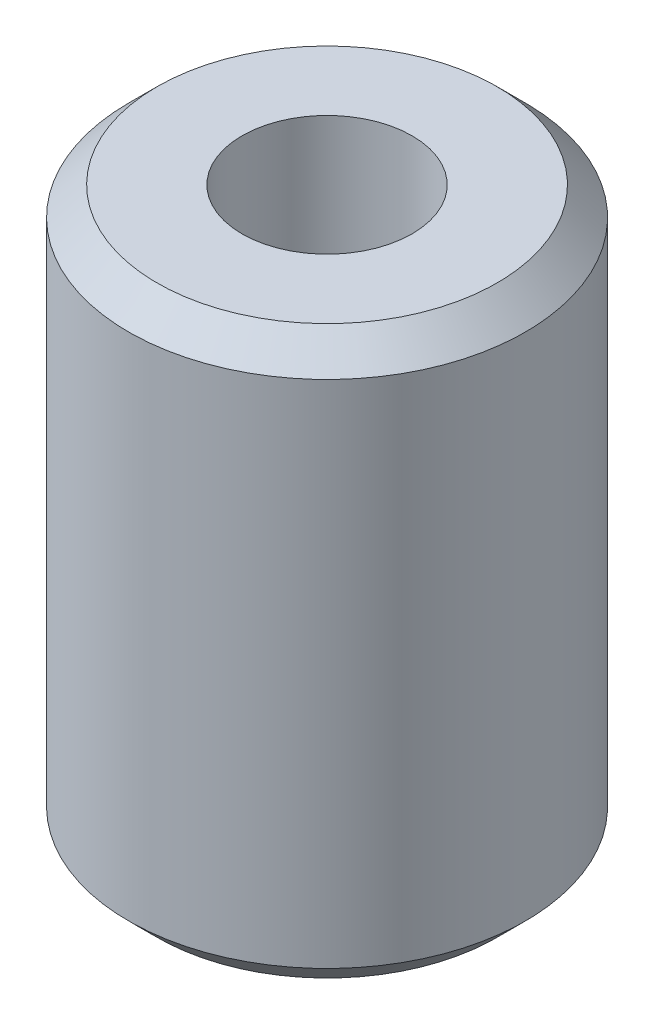
ISO-10303-21;
HEADER;
FILE_DESCRIPTION(('STEP AP214'),'2;1');
FILE_NAME('part.step','',(''),(''),'','','');
FILE_SCHEMA(('AUTOMOTIVE_DESIGN { 1 0 10303 214 1 1 1 1 }'));
ENDSEC;
DATA;
#1=APPLICATION_CONTEXT('core data for automotive mechanical design processes');
#2=APPLICATION_PROTOCOL_DEFINITION('international standard','automotive_design',2000,#1);
#3=PRODUCT_CONTEXT('',#1,'mechanical');
#4=PRODUCT('Part','Part','',(#3));
#5=PRODUCT_RELATED_PRODUCT_CATEGORY('part','',(#4));
#6=PRODUCT_DEFINITION_FORMATION('','',#4);
#7=PRODUCT_DEFINITION_CONTEXT('part definition',#1,'design');
#8=PRODUCT_DEFINITION('design','',#6,#7);
#9=PRODUCT_DEFINITION_SHAPE('','',#8);
#10=(LENGTH_UNIT() NAMED_UNIT(*) SI_UNIT(.MILLI.,.METRE.));
#11=(NAMED_UNIT(*) PLANE_ANGLE_UNIT() SI_UNIT($,.RADIAN.));
#12=(NAMED_UNIT(*) SI_UNIT($,.STERADIAN.) SOLID_ANGLE_UNIT());
#13=UNCERTAINTY_MEASURE_WITH_UNIT(LENGTH_MEASURE(1.E-05),#10,'distance_accuracy_value','');
#14=(GEOMETRIC_REPRESENTATION_CONTEXT(3) GLOBAL_UNCERTAINTY_ASSIGNED_CONTEXT((#13)) GLOBAL_UNIT_ASSIGNED_CONTEXT((#10,
#11,#12)) REPRESENTATION_CONTEXT('',''));
#15=CARTESIAN_POINT('',(0.,0.,0.));
#16=DIRECTION('',(0.,0.,1.));
#17=DIRECTION('',(1.,0.,0.));
#18=AXIS2_PLACEMENT_3D('',#15,#16,#17);
#19=CARTESIAN_POINT('',(1.5,5.,0.));
#20=DIRECTION('',(0.,-1.,0.));
#21=DIRECTION('',(1.,0.,0.));
#22=AXIS2_PLACEMENT_3D('',#19,#20,#21);
#23=PLANE('',#22);
#24=CARTESIAN_POINT('',(0.,5.,0.));
#25=DIRECTION('',(0.,1.,0.));
#26=DIRECTION('',(-1.,0.,0.));
#27=AXIS2_PLACEMENT_3D('',#24,#25,#26);
#28=CIRCLE('',#27,1.5);
#29=CARTESIAN_POINT('',(-1.50000000000001,5.,0.));
#30=VERTEX_POINT('',#29);
#31=EDGE_CURVE('E10',#30,#30,#28,.T.);
#32=ORIENTED_EDGE('',*,*,#31,.F.);
#33=EDGE_LOOP('',(#32));
#34=FACE_BOUND('',#33,.T.);
#35=CARTESIAN_POINT('',(0.,5.,0.));
#36=DIRECTION('',(0.,1.,0.));
#37=DIRECTION('',(-1.,0.,0.));
#38=AXIS2_PLACEMENT_3D('',#35,#36,#37);
#39=CIRCLE('',#38,3.);
#40=CARTESIAN_POINT('',(-3.,5.,0.));
#41=VERTEX_POINT('',#40);
#42=EDGE_CURVE('E62',#41,#41,#39,.T.);
#43=ORIENTED_EDGE('',*,*,#42,.T.);
#44=EDGE_LOOP('',(#43));
#45=FACE_BOUND('',#44,.T.);
#46=ADVANCED_FACE('F43',(#34,#45),#23,.F.);
#47=CARTESIAN_POINT('',(0.,5.,0.));
#48=DIRECTION('',(0.,1.,0.));
#49=DIRECTION('',(-1.,0.,0.));
#50=AXIS2_PLACEMENT_3D('',#47,#48,#49);
#51=CYLINDRICAL_SURFACE('',#50,1.5);
#52=CARTESIAN_POINT('',(0.,-5.,0.));
#53=DIRECTION('',(0.,1.,0.));
#54=DIRECTION('',(-1.,0.,0.));
#55=AXIS2_PLACEMENT_3D('',#52,#53,#54);
#56=CIRCLE('',#55,1.5);
#57=CARTESIAN_POINT('',(-1.5,-5.,0.));
#58=VERTEX_POINT('',#57);
#59=EDGE_CURVE('E47',#58,#58,#56,.T.);
#60=ORIENTED_EDGE('',*,*,#59,.F.);
#61=EDGE_LOOP('',(#60));
#62=FACE_BOUND('',#61,.T.);
#63=ORIENTED_EDGE('',*,*,#31,.T.);
#64=EDGE_LOOP('',(#63));
#65=FACE_BOUND('',#64,.T.);
#66=ADVANCED_FACE('F86',(#62,#65),#51,.F.);
#67=CARTESIAN_POINT('',(3.,-5.,0.));
#68=DIRECTION('',(0.,1.,0.));
#69=DIRECTION('',(-1.,0.,0.));
#70=AXIS2_PLACEMENT_3D('',#67,#68,#69);
#71=PLANE('',#70);
#72=CARTESIAN_POINT('',(0.,-5.,0.));
#73=DIRECTION('',(0.,1.,0.));
#74=DIRECTION('',(-1.,0.,0.));
#75=AXIS2_PLACEMENT_3D('',#72,#73,#74);
#76=CIRCLE('',#75,3.);
#77=CARTESIAN_POINT('',(-3.,-5.,0.));
#78=VERTEX_POINT('',#77);
#79=EDGE_CURVE('E52',#78,#78,#76,.T.);
#80=ORIENTED_EDGE('',*,*,#79,.F.);
#81=EDGE_LOOP('',(#80));
#82=FACE_BOUND('',#81,.T.);
#83=ORIENTED_EDGE('',*,*,#59,.T.);
#84=EDGE_LOOP('',(#83));
#85=FACE_BOUND('',#84,.T.);
#86=ADVANCED_FACE('F82',(#82,#85),#71,.F.);
#87=CARTESIAN_POINT('',(0.,-5.,0.));
#88=DIRECTION('',(0.,1.,0.));
#89=DIRECTION('',(-1.,0.,0.));
#90=AXIS2_PLACEMENT_3D('',#87,#88,#89);
#91=CONICAL_SURFACE('',#90,3.,0.785398163397448);
#92=CARTESIAN_POINT('',(0.,-4.5,0.));
#93=DIRECTION('',(0.,1.,0.));
#94=DIRECTION('',(-1.,0.,0.));
#95=AXIS2_PLACEMENT_3D('',#92,#93,#94);
#96=CIRCLE('',#95,3.5);
#97=CARTESIAN_POINT('',(-3.5,-4.5,0.));
#98=VERTEX_POINT('',#97);
#99=EDGE_CURVE('E60',#98,#98,#96,.T.);
#100=ORIENTED_EDGE('',*,*,#99,.F.);
#101=EDGE_LOOP('',(#100));
#102=FACE_BOUND('',#101,.T.);
#103=ORIENTED_EDGE('',*,*,#79,.T.);
#104=EDGE_LOOP('',(#103));
#105=FACE_BOUND('',#104,.T.);
#106=ADVANCED_FACE('F79',(#102,#105),#91,.T.);
#107=CARTESIAN_POINT('',(0.,5.,0.));
#108=DIRECTION('',(0.,1.,0.));
#109=DIRECTION('',(-1.,0.,0.));
#110=AXIS2_PLACEMENT_3D('',#107,#108,#109);
#111=CYLINDRICAL_SURFACE('',#110,3.5);
#112=CARTESIAN_POINT('',(0.,4.5,0.));
#113=DIRECTION('',(0.,1.,0.));
#114=DIRECTION('',(-1.,0.,0.));
#115=AXIS2_PLACEMENT_3D('',#112,#113,#114);
#116=CIRCLE('',#115,3.5);
#117=CARTESIAN_POINT('',(-3.5,4.5,0.));
#118=VERTEX_POINT('',#117);
#119=EDGE_CURVE('E61',#118,#118,#116,.T.);
#120=ORIENTED_EDGE('',*,*,#119,.F.);
#121=EDGE_LOOP('',(#120));
#122=FACE_BOUND('',#121,.T.);
#123=ORIENTED_EDGE('',*,*,#99,.T.);
#124=EDGE_LOOP('',(#123));
#125=FACE_BOUND('',#124,.T.);
#126=ADVANCED_FACE('F73',(#122,#125),#111,.T.);
#127=CARTESIAN_POINT('',(0.,4.5,0.));
#128=DIRECTION('',(0.,-1.,0.));
#129=DIRECTION('',(1.,0.,0.));
#130=AXIS2_PLACEMENT_3D('',#127,#128,#129);
#131=CONICAL_SURFACE('',#130,3.5,0.785398163397448);
#132=ORIENTED_EDGE('',*,*,#42,.F.);
#133=EDGE_LOOP('',(#132));
#134=FACE_BOUND('',#133,.T.);
#135=ORIENTED_EDGE('',*,*,#119,.T.);
#136=EDGE_LOOP('',(#135));
#137=FACE_BOUND('',#136,.T.);
#138=ADVANCED_FACE('F66',(#134,#137),#131,.T.);
#139=CLOSED_SHELL('',(#46,#66,#86,#106,#126,#138));
#140=MANIFOLD_SOLID_BREP('B2',#139);
#141=ADVANCED_BREP_SHAPE_REPRESENTATION('',(#18,#140),#14);
#142=SHAPE_DEFINITION_REPRESENTATION(#9,#141);
ENDSEC;
END-ISO-10303-21;
